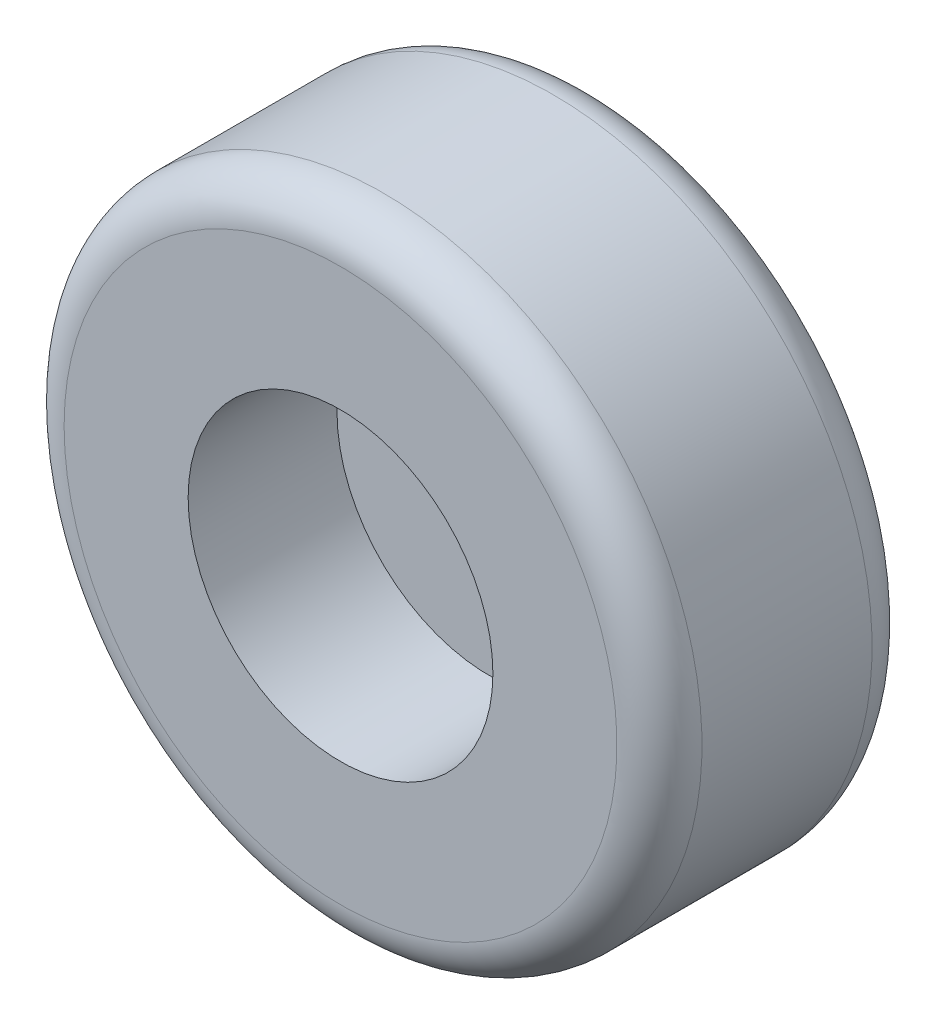
ISO-10303-21;
HEADER;
FILE_DESCRIPTION(('STEP AP214'),'2;1');
FILE_NAME('part.step','',(''),(''),'','','');
FILE_SCHEMA(('AUTOMOTIVE_DESIGN { 1 0 10303 214 1 1 1 1 }'));
ENDSEC;
DATA;
#1=APPLICATION_CONTEXT('core data for automotive mechanical design processes');
#2=APPLICATION_PROTOCOL_DEFINITION('international standard','automotive_design',2000,#1);
#3=PRODUCT_CONTEXT('',#1,'mechanical');
#4=PRODUCT('Part','Part','',(#3));
#5=PRODUCT_RELATED_PRODUCT_CATEGORY('part','',(#4));
#6=PRODUCT_DEFINITION_FORMATION('','',#4);
#7=PRODUCT_DEFINITION_CONTEXT('part definition',#1,'design');
#8=PRODUCT_DEFINITION('design','',#6,#7);
#9=PRODUCT_DEFINITION_SHAPE('','',#8);
#10=(LENGTH_UNIT() NAMED_UNIT(*) SI_UNIT(.MILLI.,.METRE.));
#11=(NAMED_UNIT(*) PLANE_ANGLE_UNIT() SI_UNIT($,.RADIAN.));
#12=(NAMED_UNIT(*) SI_UNIT($,.STERADIAN.) SOLID_ANGLE_UNIT());
#13=UNCERTAINTY_MEASURE_WITH_UNIT(LENGTH_MEASURE(1.E-05),#10,'distance_accuracy_value','');
#14=(GEOMETRIC_REPRESENTATION_CONTEXT(3) GLOBAL_UNCERTAINTY_ASSIGNED_CONTEXT((#13)) GLOBAL_UNIT_ASSIGNED_CONTEXT((#10,
#11,#12)) REPRESENTATION_CONTEXT('',''));
#15=CARTESIAN_POINT('',(0.,0.,0.));
#16=DIRECTION('',(0.,0.,1.));
#17=DIRECTION('',(1.,0.,0.));
#18=AXIS2_PLACEMENT_3D('',#15,#16,#17);
#19=CARTESIAN_POINT('',(0.,0.,7.5));
#20=DIRECTION('',(0.,0.,-1.));
#21=DIRECTION('',(-1.,0.,0.));
#22=AXIS2_PLACEMENT_3D('',#19,#20,#21);
#23=PLANE('',#22);
#24=CARTESIAN_POINT('',(0.,0.,7.5));
#25=DIRECTION('',(0.,0.,-1.));
#26=DIRECTION('',(-1.,0.,0.));
#27=AXIS2_PLACEMENT_3D('',#24,#25,#26);
#28=CIRCLE('',#27,10.75);
#29=CARTESIAN_POINT('',(-10.75,0.,7.5));
#30=VERTEX_POINT('',#29);
#31=EDGE_CURVE('E11',#30,#30,#28,.T.);
#32=ORIENTED_EDGE('',*,*,#31,.F.);
#33=EDGE_LOOP('',(#32));
#34=FACE_BOUND('',#33,.T.);
#35=CARTESIAN_POINT('',(0.,0.,7.5));
#36=DIRECTION('',(0.,0.,-1.));
#37=DIRECTION('',(-1.,0.,0.));
#38=AXIS2_PLACEMENT_3D('',#35,#36,#37);
#39=CIRCLE('',#38,1.5);
#40=CARTESIAN_POINT('',(-1.11803398874989,1.,7.5));
#41=VERTEX_POINT('',#40);
#42=CARTESIAN_POINT('',(1.11803398874989,1.,7.5));
#43=VERTEX_POINT('',#42);
#44=EDGE_CURVE('E67',#41,#43,#39,.F.);
#45=ORIENTED_EDGE('',*,*,#44,.F.);
#46=DIRECTION('',(-1.,0.,0.));
#47=VECTOR('',#46,1.);
#48=CARTESIAN_POINT('',(0.,1.,7.5));
#49=LINE('',#48,#47);
#50=EDGE_CURVE('E72',#43,#41,#49,.T.);
#51=ORIENTED_EDGE('',*,*,#50,.F.);
#52=EDGE_LOOP('',(#45,#51));
#53=FACE_BOUND('',#52,.T.);
#54=ADVANCED_FACE('F41',(#34,#53),#23,.F.);
#55=CARTESIAN_POINT('',(0.,0.,0.));
#56=DIRECTION('',(0.,0.,1.));
#57=DIRECTION('',(1.,0.,0.));
#58=AXIS2_PLACEMENT_3D('',#55,#56,#57);
#59=PLANE('',#58);
#60=CARTESIAN_POINT('',(0.,0.,0.));
#61=DIRECTION('',(0.,0.,-1.));
#62=DIRECTION('',(-1.,0.,0.));
#63=AXIS2_PLACEMENT_3D('',#60,#61,#62);
#64=CIRCLE('',#63,19.5);
#65=CARTESIAN_POINT('',(-19.5,0.,0.));
#66=VERTEX_POINT('',#65);
#67=EDGE_CURVE('E84',#66,#66,#64,.T.);
#68=ORIENTED_EDGE('',*,*,#67,.T.);
#69=EDGE_LOOP('',(#68));
#70=FACE_BOUND('',#69,.T.);
#71=CARTESIAN_POINT('',(0.,0.,0.));
#72=DIRECTION('',(0.,0.,1.));
#73=DIRECTION('',(1.,0.,0.));
#74=AXIS2_PLACEMENT_3D('',#71,#72,#73);
#75=CIRCLE('',#74,1.5);
#76=CARTESIAN_POINT('',(-1.11803398874989,1.,0.));
#77=VERTEX_POINT('',#76);
#78=CARTESIAN_POINT('',(1.11803398874989,1.,0.));
#79=VERTEX_POINT('',#78);
#80=EDGE_CURVE('E65',#77,#79,#75,.T.);
#81=ORIENTED_EDGE('',*,*,#80,.T.);
#82=DIRECTION('',(-1.,0.,0.));
#83=VECTOR('',#82,1.);
#84=CARTESIAN_POINT('',(-1.11803398874989,1.,0.));
#85=LINE('',#84,#83);
#86=EDGE_CURVE('E73',#79,#77,#85,.T.);
#87=ORIENTED_EDGE('',*,*,#86,.T.);
#88=EDGE_LOOP('',(#81,#87));
#89=FACE_BOUND('',#88,.T.);
#90=ADVANCED_FACE('F76',(#70,#89),#59,.F.);
#91=CARTESIAN_POINT('',(0.,0.,-41.8489912506433));
#92=DIRECTION('',(0.,0.,-1.));
#93=DIRECTION('',(-1.,0.,0.));
#94=AXIS2_PLACEMENT_3D('',#91,#92,#93);
#95=CYLINDRICAL_SURFACE('',#94,10.75);
#96=CARTESIAN_POINT('',(0.,0.,18.));
#97=DIRECTION('',(0.,0.,-1.));
#98=DIRECTION('',(-1.,0.,0.));
#99=AXIS2_PLACEMENT_3D('',#96,#97,#98);
#100=CIRCLE('',#99,10.75);
#101=CARTESIAN_POINT('',(-10.75,0.,18.));
#102=VERTEX_POINT('',#101);
#103=EDGE_CURVE('E48',#102,#102,#100,.T.);
#104=ORIENTED_EDGE('',*,*,#103,.F.);
#105=EDGE_LOOP('',(#104));
#106=FACE_BOUND('',#105,.T.);
#107=ORIENTED_EDGE('',*,*,#31,.T.);
#108=EDGE_LOOP('',(#107));
#109=FACE_BOUND('',#108,.T.);
#110=ADVANCED_FACE('F101',(#106,#109),#95,.F.);
#111=CARTESIAN_POINT('',(10.75,0.,18.));
#112=DIRECTION('',(0.,0.,-1.));
#113=DIRECTION('',(-1.,0.,0.));
#114=AXIS2_PLACEMENT_3D('',#111,#112,#113);
#115=PLANE('',#114);
#116=CARTESIAN_POINT('',(0.,0.,18.));
#117=DIRECTION('',(0.,0.,-1.));
#118=DIRECTION('',(-1.,0.,0.));
#119=AXIS2_PLACEMENT_3D('',#116,#117,#118);
#120=CIRCLE('',#119,19.5);
#121=CARTESIAN_POINT('',(-19.5,0.,18.));
#122=VERTEX_POINT('',#121);
#123=EDGE_CURVE('E94',#122,#122,#120,.T.);
#124=ORIENTED_EDGE('',*,*,#123,.F.);
#125=EDGE_LOOP('',(#124));
#126=FACE_BOUND('',#125,.T.);
#127=ORIENTED_EDGE('',*,*,#103,.T.);
#128=EDGE_LOOP('',(#127));
#129=FACE_BOUND('',#128,.T.);
#130=ADVANCED_FACE('F97',(#126,#129),#115,.F.);
#131=CARTESIAN_POINT('',(0.,0.,15.));
#132=DIRECTION('',(0.,0.,-1.));
#133=DIRECTION('',(-1.,0.,0.));
#134=AXIS2_PLACEMENT_3D('',#131,#132,#133);
#135=TOROIDAL_SURFACE('',#134,19.5,3.);
#136=CARTESIAN_POINT('',(0.,0.,15.));
#137=DIRECTION('',(0.,0.,-1.));
#138=DIRECTION('',(-1.,0.,0.));
#139=AXIS2_PLACEMENT_3D('',#136,#137,#138);
#140=CIRCLE('',#139,22.5);
#141=CARTESIAN_POINT('',(-22.5,0.,15.));
#142=VERTEX_POINT('',#141);
#143=EDGE_CURVE('E93',#142,#142,#140,.T.);
#144=ORIENTED_EDGE('',*,*,#143,.F.);
#145=EDGE_LOOP('',(#144));
#146=FACE_BOUND('',#145,.T.);
#147=ORIENTED_EDGE('',*,*,#123,.T.);
#148=EDGE_LOOP('',(#147));
#149=FACE_BOUND('',#148,.T.);
#150=ADVANCED_FACE('F127',(#146,#149),#135,.T.);
#151=CARTESIAN_POINT('',(0.,0.,-41.8489912506433));
#152=DIRECTION('',(0.,0.,-1.));
#153=DIRECTION('',(-1.,0.,0.));
#154=AXIS2_PLACEMENT_3D('',#151,#152,#153);
#155=CYLINDRICAL_SURFACE('',#154,22.5);
#156=CARTESIAN_POINT('',(0.,0.,3.));
#157=DIRECTION('',(0.,0.,-1.));
#158=DIRECTION('',(-1.,0.,0.));
#159=AXIS2_PLACEMENT_3D('',#156,#157,#158);
#160=CIRCLE('',#159,22.5);
#161=CARTESIAN_POINT('',(-22.5,0.,3.));
#162=VERTEX_POINT('',#161);
#163=EDGE_CURVE('E86',#162,#162,#160,.T.);
#164=ORIENTED_EDGE('',*,*,#163,.F.);
#165=EDGE_LOOP('',(#164));
#166=FACE_BOUND('',#165,.T.);
#167=ORIENTED_EDGE('',*,*,#143,.T.);
#168=EDGE_LOOP('',(#167));
#169=FACE_BOUND('',#168,.T.);
#170=ADVANCED_FACE('F125',(#166,#169),#155,.T.);
#171=CARTESIAN_POINT('',(0.,0.,3.));
#172=DIRECTION('',(0.,0.,-1.));
#173=DIRECTION('',(-1.,0.,0.));
#174=AXIS2_PLACEMENT_3D('',#171,#172,#173);
#175=TOROIDAL_SURFACE('',#174,19.5,3.);
#176=ORIENTED_EDGE('',*,*,#67,.F.);
#177=EDGE_LOOP('',(#176));
#178=FACE_BOUND('',#177,.T.);
#179=ORIENTED_EDGE('',*,*,#163,.T.);
#180=EDGE_LOOP('',(#179));
#181=FACE_BOUND('',#180,.T.);
#182=ADVANCED_FACE('F118',(#178,#181),#175,.T.);
#183=CARTESIAN_POINT('',(0.,0.,18.));
#184=DIRECTION('',(0.,0.,-1.));
#185=DIRECTION('',(-1.,0.,0.));
#186=AXIS2_PLACEMENT_3D('',#183,#184,#185);
#187=CYLINDRICAL_SURFACE('',#186,1.5);
#188=ORIENTED_EDGE('',*,*,#44,.T.);
#189=DIRECTION('',(0.,0.,-1.));
#190=VECTOR('',#189,1.);
#191=CARTESIAN_POINT('',(1.11803398874989,1.,18.));
#192=LINE('',#191,#190);
#193=EDGE_CURVE('E54',#43,#79,#192,.T.);
#194=ORIENTED_EDGE('',*,*,#193,.T.);
#195=ORIENTED_EDGE('',*,*,#80,.F.);
#196=DIRECTION('',(0.,0.,-1.));
#197=VECTOR('',#196,1.);
#198=CARTESIAN_POINT('',(-1.11803398874989,1.,18.));
#199=LINE('',#198,#197);
#200=EDGE_CURVE('E75',#41,#77,#199,.T.);
#201=ORIENTED_EDGE('',*,*,#200,.F.);
#202=EDGE_LOOP('',(#188,#194,#195,#201));
#203=FACE_BOUND('',#202,.T.);
#204=ADVANCED_FACE('F70',(#203),#187,.F.);
#205=CARTESIAN_POINT('',(-1.11803398874989,1.,18.));
#206=DIRECTION('',(0.,-1.,0.));
#207=DIRECTION('',(0.,0.,-1.));
#208=AXIS2_PLACEMENT_3D('',#205,#206,#207);
#209=PLANE('',#208);
#210=ORIENTED_EDGE('',*,*,#50,.T.);
#211=ORIENTED_EDGE('',*,*,#200,.T.);
#212=ORIENTED_EDGE('',*,*,#86,.F.);
#213=ORIENTED_EDGE('',*,*,#193,.F.);
#214=EDGE_LOOP('',(#210,#211,#212,#213));
#215=FACE_BOUND('',#214,.T.);
#216=ADVANCED_FACE('F77',(#215),#209,.T.);
#217=CLOSED_SHELL('',(#54,#90,#110,#130,#150,#170,#182,#204,#216));
#218=MANIFOLD_SOLID_BREP('B2',#217);
#219=ADVANCED_BREP_SHAPE_REPRESENTATION('',(#18,#218),#14);
#220=SHAPE_DEFINITION_REPRESENTATION(#9,#219);
ENDSEC;
END-ISO-10303-21;
